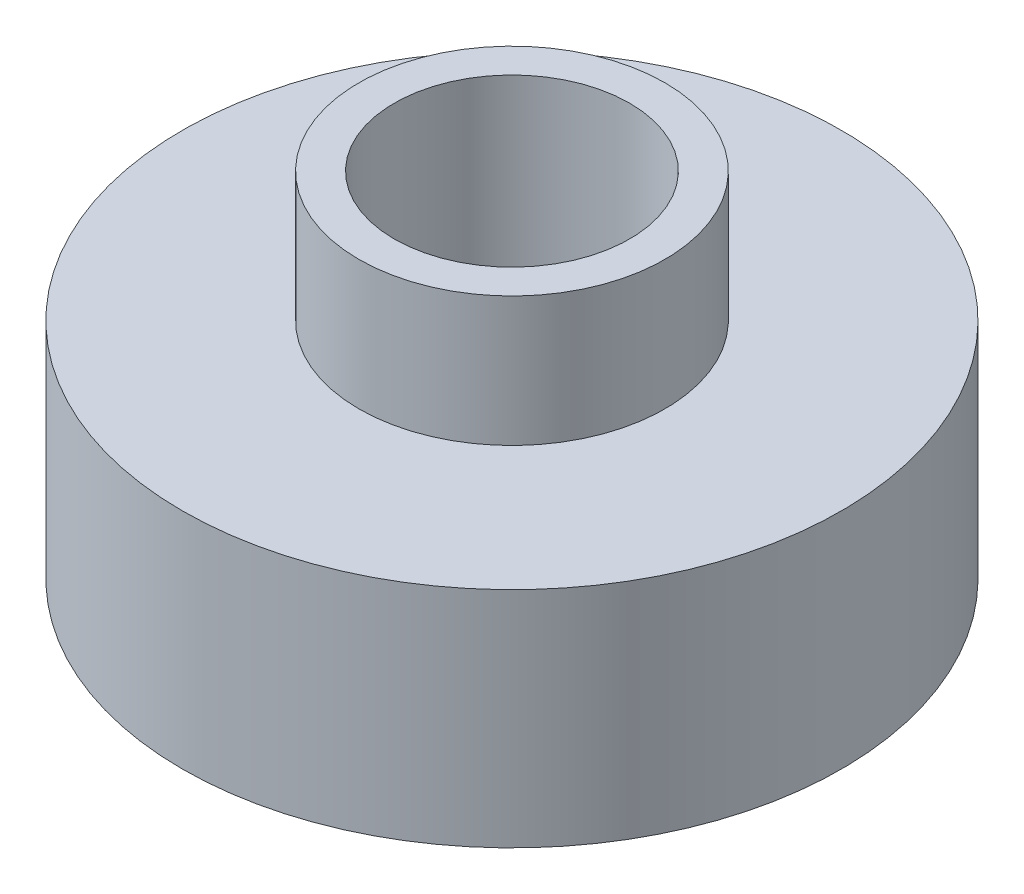
ISO-10303-21;
HEADER;
FILE_DESCRIPTION(('STEP AP214'),'2;1');
FILE_NAME('part.step','',(''),(''),'','','');
FILE_SCHEMA(('AUTOMOTIVE_DESIGN { 1 0 10303 214 1 1 1 1 }'));
ENDSEC;
DATA;
#1=APPLICATION_CONTEXT('core data for automotive mechanical design processes');
#2=APPLICATION_PROTOCOL_DEFINITION('international standard','automotive_design',2000,#1);
#3=PRODUCT_CONTEXT('',#1,'mechanical');
#4=PRODUCT('Part','Part','',(#3));
#5=PRODUCT_RELATED_PRODUCT_CATEGORY('part','',(#4));
#6=PRODUCT_DEFINITION_FORMATION('','',#4);
#7=PRODUCT_DEFINITION_CONTEXT('part definition',#1,'design');
#8=PRODUCT_DEFINITION('design','',#6,#7);
#9=PRODUCT_DEFINITION_SHAPE('','',#8);
#10=(LENGTH_UNIT() NAMED_UNIT(*) SI_UNIT(.MILLI.,.METRE.));
#11=(NAMED_UNIT(*) PLANE_ANGLE_UNIT() SI_UNIT($,.RADIAN.));
#12=(NAMED_UNIT(*) SI_UNIT($,.STERADIAN.) SOLID_ANGLE_UNIT());
#13=UNCERTAINTY_MEASURE_WITH_UNIT(LENGTH_MEASURE(1.E-05),#10,'distance_accuracy_value','');
#14=(GEOMETRIC_REPRESENTATION_CONTEXT(3) GLOBAL_UNCERTAINTY_ASSIGNED_CONTEXT((#13)) GLOBAL_UNIT_ASSIGNED_CONTEXT((#10,
#11,#12)) REPRESENTATION_CONTEXT('',''));
#15=CARTESIAN_POINT('',(0.,0.,0.));
#16=DIRECTION('',(0.,0.,1.));
#17=DIRECTION('',(1.,0.,0.));
#18=AXIS2_PLACEMENT_3D('',#15,#16,#17);
#19=CARTESIAN_POINT('',(0.,93.4931836407378,0.));
#20=DIRECTION('',(0.,1.,0.));
#21=DIRECTION('',(0.,0.,1.));
#22=AXIS2_PLACEMENT_3D('',#19,#20,#21);
#23=CYLINDRICAL_SURFACE('',#22,48.);
#24=CARTESIAN_POINT('',(0.,0.,0.));
#25=DIRECTION('',(0.,1.,0.));
#26=DIRECTION('',(0.,0.,1.));
#27=AXIS2_PLACEMENT_3D('',#24,#25,#26);
#28=CIRCLE('',#27,48.);
#29=CARTESIAN_POINT('',(0.,0.,48.));
#30=VERTEX_POINT('',#29);
#31=EDGE_CURVE('E12',#30,#30,#28,.T.);
#32=ORIENTED_EDGE('',*,*,#31,.F.);
#33=EDGE_LOOP('',(#32));
#34=FACE_BOUND('',#33,.T.);
#35=CARTESIAN_POINT('',(0.,28.,0.));
#36=DIRECTION('',(0.,1.,0.));
#37=DIRECTION('',(0.,0.,1.));
#38=AXIS2_PLACEMENT_3D('',#35,#36,#37);
#39=CIRCLE('',#38,48.);
#40=CARTESIAN_POINT('',(0.,28.,48.));
#41=VERTEX_POINT('',#40);
#42=EDGE_CURVE('E69',#41,#41,#39,.T.);
#43=ORIENTED_EDGE('',*,*,#42,.T.);
#44=EDGE_LOOP('',(#43));
#45=FACE_BOUND('',#44,.T.);
#46=ADVANCED_FACE('F41',(#34,#45),#23,.F.);
#47=CARTESIAN_POINT('',(56.,0.,0.));
#48=DIRECTION('',(0.,1.,0.));
#49=DIRECTION('',(0.,0.,1.));
#50=AXIS2_PLACEMENT_3D('',#47,#48,#49);
#51=PLANE('',#50);
#52=CARTESIAN_POINT('',(0.,0.,0.));
#53=DIRECTION('',(0.,1.,0.));
#54=DIRECTION('',(0.,0.,1.));
#55=AXIS2_PLACEMENT_3D('',#52,#53,#54);
#56=CIRCLE('',#55,56.);
#57=CARTESIAN_POINT('',(0.,0.,56.));
#58=VERTEX_POINT('',#57);
#59=EDGE_CURVE('E47',#58,#58,#56,.T.);
#60=ORIENTED_EDGE('',*,*,#59,.F.);
#61=EDGE_LOOP('',(#60));
#62=FACE_BOUND('',#61,.T.);
#63=ORIENTED_EDGE('',*,*,#31,.T.);
#64=EDGE_LOOP('',(#63));
#65=FACE_BOUND('',#64,.T.);
#66=ADVANCED_FACE('F106',(#62,#65),#51,.F.);
#67=CARTESIAN_POINT('',(0.,93.4931836407378,0.));
#68=DIRECTION('',(0.,1.,0.));
#69=DIRECTION('',(0.,0.,1.));
#70=AXIS2_PLACEMENT_3D('',#67,#68,#69);
#71=CYLINDRICAL_SURFACE('',#70,56.);
#72=CARTESIAN_POINT('',(0.,38.,0.));
#73=DIRECTION('',(0.,1.,0.));
#74=DIRECTION('',(0.,0.,1.));
#75=AXIS2_PLACEMENT_3D('',#72,#73,#74);
#76=CIRCLE('',#75,56.);
#77=CARTESIAN_POINT('',(0.,38.,56.));
#78=VERTEX_POINT('',#77);
#79=EDGE_CURVE('E51',#78,#78,#76,.T.);
#80=ORIENTED_EDGE('',*,*,#79,.F.);
#81=EDGE_LOOP('',(#80));
#82=FACE_BOUND('',#81,.T.);
#83=ORIENTED_EDGE('',*,*,#59,.T.);
#84=EDGE_LOOP('',(#83));
#85=FACE_BOUND('',#84,.T.);
#86=ADVANCED_FACE('F101',(#82,#85),#71,.T.);
#87=CARTESIAN_POINT('',(56.,38.,0.));
#88=DIRECTION('',(0.,-1.,0.));
#89=DIRECTION('',(0.,0.,-1.));
#90=AXIS2_PLACEMENT_3D('',#87,#88,#89);
#91=PLANE('',#90);
#92=CARTESIAN_POINT('',(0.,38.,0.));
#93=DIRECTION('',(0.,1.,0.));
#94=DIRECTION('',(0.,0.,1.));
#95=AXIS2_PLACEMENT_3D('',#92,#93,#94);
#96=CIRCLE('',#95,26.);
#97=CARTESIAN_POINT('',(0.,38.,26.));
#98=VERTEX_POINT('',#97);
#99=EDGE_CURVE('E55',#98,#98,#96,.T.);
#100=ORIENTED_EDGE('',*,*,#99,.F.);
#101=EDGE_LOOP('',(#100));
#102=FACE_BOUND('',#101,.T.);
#103=ORIENTED_EDGE('',*,*,#79,.T.);
#104=EDGE_LOOP('',(#103));
#105=FACE_BOUND('',#104,.T.);
#106=ADVANCED_FACE('F95',(#102,#105),#91,.F.);
#107=CARTESIAN_POINT('',(0.,93.4931836407378,0.));
#108=DIRECTION('',(0.,1.,0.));
#109=DIRECTION('',(0.,0.,1.));
#110=AXIS2_PLACEMENT_3D('',#107,#108,#109);
#111=CYLINDRICAL_SURFACE('',#110,26.);
#112=CARTESIAN_POINT('',(0.,60.,0.));
#113=DIRECTION('',(0.,1.,0.));
#114=DIRECTION('',(0.,0.,1.));
#115=AXIS2_PLACEMENT_3D('',#112,#113,#114);
#116=CIRCLE('',#115,26.);
#117=CARTESIAN_POINT('',(0.,60.,26.));
#118=VERTEX_POINT('',#117);
#119=EDGE_CURVE('E60',#118,#118,#116,.T.);
#120=ORIENTED_EDGE('',*,*,#119,.F.);
#121=EDGE_LOOP('',(#120));
#122=FACE_BOUND('',#121,.T.);
#123=ORIENTED_EDGE('',*,*,#99,.T.);
#124=EDGE_LOOP('',(#123));
#125=FACE_BOUND('',#124,.T.);
#126=ADVANCED_FACE('F89',(#122,#125),#111,.T.);
#127=CARTESIAN_POINT('',(26.,60.,0.));
#128=DIRECTION('',(0.,-1.,0.));
#129=DIRECTION('',(0.,0.,-1.));
#130=AXIS2_PLACEMENT_3D('',#127,#128,#129);
#131=PLANE('',#130);
#132=CARTESIAN_POINT('',(0.,60.,0.));
#133=DIRECTION('',(0.,1.,0.));
#134=DIRECTION('',(0.,0.,1.));
#135=AXIS2_PLACEMENT_3D('',#132,#133,#134);
#136=CIRCLE('',#135,20.);
#137=CARTESIAN_POINT('',(0.,60.,20.));
#138=VERTEX_POINT('',#137);
#139=EDGE_CURVE('E63',#138,#138,#136,.T.);
#140=ORIENTED_EDGE('',*,*,#139,.F.);
#141=EDGE_LOOP('',(#140));
#142=FACE_BOUND('',#141,.T.);
#143=ORIENTED_EDGE('',*,*,#119,.T.);
#144=EDGE_LOOP('',(#143));
#145=FACE_BOUND('',#144,.T.);
#146=ADVANCED_FACE('F83',(#142,#145),#131,.F.);
#147=CARTESIAN_POINT('',(0.,93.4931836407378,0.));
#148=DIRECTION('',(0.,1.,0.));
#149=DIRECTION('',(0.,0.,1.));
#150=AXIS2_PLACEMENT_3D('',#147,#148,#149);
#151=CYLINDRICAL_SURFACE('',#150,20.);
#152=CARTESIAN_POINT('',(0.,28.,0.));
#153=DIRECTION('',(0.,1.,0.));
#154=DIRECTION('',(0.,0.,1.));
#155=AXIS2_PLACEMENT_3D('',#152,#153,#154);
#156=CIRCLE('',#155,20.);
#157=CARTESIAN_POINT('',(0.,28.,20.));
#158=VERTEX_POINT('',#157);
#159=EDGE_CURVE('E66',#158,#158,#156,.T.);
#160=ORIENTED_EDGE('',*,*,#159,.F.);
#161=EDGE_LOOP('',(#160));
#162=FACE_BOUND('',#161,.T.);
#163=ORIENTED_EDGE('',*,*,#139,.T.);
#164=EDGE_LOOP('',(#163));
#165=FACE_BOUND('',#164,.T.);
#166=ADVANCED_FACE('F77',(#162,#165),#151,.F.);
#167=CARTESIAN_POINT('',(48.,28.,0.));
#168=DIRECTION('',(0.,1.,0.));
#169=DIRECTION('',(0.,0.,1.));
#170=AXIS2_PLACEMENT_3D('',#167,#168,#169);
#171=PLANE('',#170);
#172=ORIENTED_EDGE('',*,*,#42,.F.);
#173=EDGE_LOOP('',(#172));
#174=FACE_BOUND('',#173,.T.);
#175=ORIENTED_EDGE('',*,*,#159,.T.);
#176=EDGE_LOOP('',(#175));
#177=FACE_BOUND('',#176,.T.);
#178=ADVANCED_FACE('F74',(#174,#177),#171,.F.);
#179=CLOSED_SHELL('',(#46,#66,#86,#106,#126,#146,#166,#178));
#180=MANIFOLD_SOLID_BREP('B2',#179);
#181=ADVANCED_BREP_SHAPE_REPRESENTATION('',(#18,#180),#14);
#182=SHAPE_DEFINITION_REPRESENTATION(#9,#181);
ENDSEC;
END-ISO-10303-21;
